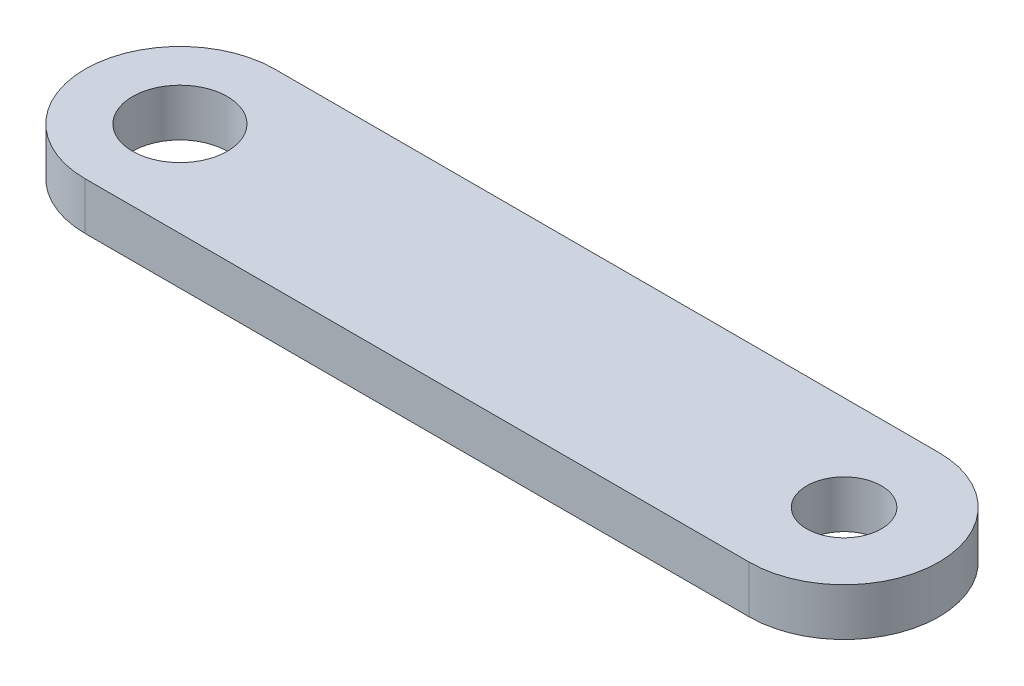
ISO-10303-21;
HEADER;
FILE_DESCRIPTION(('STEP AP214'),'2;1');
FILE_NAME('part.step','',(''),(''),'','','');
FILE_SCHEMA(('AUTOMOTIVE_DESIGN { 1 0 10303 214 1 1 1 1 }'));
ENDSEC;
DATA;
#1=APPLICATION_CONTEXT('core data for automotive mechanical design processes');
#2=APPLICATION_PROTOCOL_DEFINITION('international standard','automotive_design',2000,#1);
#3=PRODUCT_CONTEXT('',#1,'mechanical');
#4=PRODUCT('Part','Part','',(#3));
#5=PRODUCT_RELATED_PRODUCT_CATEGORY('part','',(#4));
#6=PRODUCT_DEFINITION_FORMATION('','',#4);
#7=PRODUCT_DEFINITION_CONTEXT('part definition',#1,'design');
#8=PRODUCT_DEFINITION('design','',#6,#7);
#9=PRODUCT_DEFINITION_SHAPE('','',#8);
#10=(LENGTH_UNIT() NAMED_UNIT(*) SI_UNIT(.MILLI.,.METRE.));
#11=(NAMED_UNIT(*) PLANE_ANGLE_UNIT() SI_UNIT($,.RADIAN.));
#12=(NAMED_UNIT(*) SI_UNIT($,.STERADIAN.) SOLID_ANGLE_UNIT());
#13=UNCERTAINTY_MEASURE_WITH_UNIT(LENGTH_MEASURE(1.E-05),#10,'distance_accuracy_value','');
#14=(GEOMETRIC_REPRESENTATION_CONTEXT(3) GLOBAL_UNCERTAINTY_ASSIGNED_CONTEXT((#13)) GLOBAL_UNIT_ASSIGNED_CONTEXT((#10,
#11,#12)) REPRESENTATION_CONTEXT('',''));
#15=CARTESIAN_POINT('',(0.,0.,0.));
#16=DIRECTION('',(0.,0.,1.));
#17=DIRECTION('',(1.,0.,0.));
#18=AXIS2_PLACEMENT_3D('',#15,#16,#17);
#19=CARTESIAN_POINT('',(0.,3.175,0.));
#20=DIRECTION('',(0.,1.,0.));
#21=DIRECTION('',(0.,0.,1.));
#22=AXIS2_PLACEMENT_3D('',#19,#20,#21);
#23=PLANE('',#22);
#24=CARTESIAN_POINT('',(0.,3.175,0.));
#25=DIRECTION('',(0.,1.,0.));
#26=DIRECTION('',(0.,0.,1.));
#27=AXIS2_PLACEMENT_3D('',#24,#25,#26);
#28=CIRCLE('',#27,3.175);
#29=CARTESIAN_POINT('',(0.,3.175,3.175));
#30=VERTEX_POINT('',#29);
#31=EDGE_CURVE('E112',#30,#30,#28,.T.);
#32=ORIENTED_EDGE('',*,*,#31,.F.);
#33=EDGE_LOOP('',(#32));
#34=FACE_BOUND('',#33,.T.);
#35=CARTESIAN_POINT('',(0.,3.175,0.));
#36=DIRECTION('',(0.,1.,0.));
#37=DIRECTION('',(0.,0.,1.));
#38=AXIS2_PLACEMENT_3D('',#35,#36,#37);
#39=CIRCLE('',#38,6.35);
#40=CARTESIAN_POINT('',(0.,3.175,-6.35));
#41=VERTEX_POINT('',#40);
#42=CARTESIAN_POINT('',(0.,3.175,6.35));
#43=VERTEX_POINT('',#42);
#44=EDGE_CURVE('E92',#41,#43,#39,.T.);
#45=ORIENTED_EDGE('',*,*,#44,.T.);
#46=DIRECTION('',(1.,0.,0.));
#47=VECTOR('',#46,1.);
#48=CARTESIAN_POINT('',(0.,3.175,6.35));
#49=LINE('',#48,#47);
#50=CARTESIAN_POINT('',(44.45,3.175,6.35));
#51=VERTEX_POINT('',#50);
#52=EDGE_CURVE('E87',#43,#51,#49,.T.);
#53=ORIENTED_EDGE('',*,*,#52,.T.);
#54=CARTESIAN_POINT('',(44.45,3.175,0.));
#55=DIRECTION('',(0.,1.,0.));
#56=DIRECTION('',(0.,0.,1.));
#57=AXIS2_PLACEMENT_3D('',#54,#55,#56);
#58=CIRCLE('',#57,6.35);
#59=CARTESIAN_POINT('',(44.45,3.175,-6.35));
#60=VERTEX_POINT('',#59);
#61=EDGE_CURVE('E90',#51,#60,#58,.T.);
#62=ORIENTED_EDGE('',*,*,#61,.T.);
#63=DIRECTION('',(-1.,0.,0.));
#64=VECTOR('',#63,1.);
#65=CARTESIAN_POINT('',(0.,3.175,-6.35));
#66=LINE('',#65,#64);
#67=EDGE_CURVE('E57',#60,#41,#66,.T.);
#68=ORIENTED_EDGE('',*,*,#67,.T.);
#69=EDGE_LOOP('',(#45,#53,#62,#68));
#70=FACE_BOUND('',#69,.T.);
#71=CARTESIAN_POINT('',(44.45,3.175,0.));
#72=DIRECTION('',(0.,1.,0.));
#73=DIRECTION('',(0.,0.,1.));
#74=AXIS2_PLACEMENT_3D('',#71,#72,#73);
#75=CIRCLE('',#74,2.5);
#76=CARTESIAN_POINT('',(44.45,3.175,2.5));
#77=VERTEX_POINT('',#76);
#78=EDGE_CURVE('E134',#77,#77,#75,.T.);
#79=ORIENTED_EDGE('',*,*,#78,.F.);
#80=EDGE_LOOP('',(#79));
#81=FACE_BOUND('',#80,.T.);
#82=ADVANCED_FACE('F39',(#34,#70,#81),#23,.T.);
#83=CARTESIAN_POINT('',(0.,0.,0.));
#84=DIRECTION('',(0.,1.,0.));
#85=DIRECTION('',(0.,0.,1.));
#86=AXIS2_PLACEMENT_3D('',#83,#84,#85);
#87=PLANE('',#86);
#88=CARTESIAN_POINT('',(0.,0.,0.));
#89=DIRECTION('',(0.,1.,0.));
#90=DIRECTION('',(0.,0.,1.));
#91=AXIS2_PLACEMENT_3D('',#88,#89,#90);
#92=CIRCLE('',#91,6.35);
#93=CARTESIAN_POINT('',(0.,0.,-6.35));
#94=VERTEX_POINT('',#93);
#95=CARTESIAN_POINT('',(0.,0.,6.35));
#96=VERTEX_POINT('',#95);
#97=EDGE_CURVE('E108',#94,#96,#92,.T.);
#98=ORIENTED_EDGE('',*,*,#97,.F.);
#99=DIRECTION('',(-1.,0.,0.));
#100=VECTOR('',#99,1.);
#101=CARTESIAN_POINT('',(0.,0.,-6.35));
#102=LINE('',#101,#100);
#103=CARTESIAN_POINT('',(44.45,0.,-6.35));
#104=VERTEX_POINT('',#103);
#105=EDGE_CURVE('E80',#104,#94,#102,.T.);
#106=ORIENTED_EDGE('',*,*,#105,.F.);
#107=CARTESIAN_POINT('',(44.45,0.,0.));
#108=DIRECTION('',(0.,1.,0.));
#109=DIRECTION('',(0.,0.,1.));
#110=AXIS2_PLACEMENT_3D('',#107,#108,#109);
#111=CIRCLE('',#110,6.35);
#112=CARTESIAN_POINT('',(44.45,0.,6.35));
#113=VERTEX_POINT('',#112);
#114=EDGE_CURVE('E74',#113,#104,#111,.T.);
#115=ORIENTED_EDGE('',*,*,#114,.F.);
#116=DIRECTION('',(1.,0.,0.));
#117=VECTOR('',#116,1.);
#118=CARTESIAN_POINT('',(0.,0.,6.35));
#119=LINE('',#118,#117);
#120=EDGE_CURVE('E97',#96,#113,#119,.T.);
#121=ORIENTED_EDGE('',*,*,#120,.F.);
#122=EDGE_LOOP('',(#98,#106,#115,#121));
#123=FACE_BOUND('',#122,.T.);
#124=CARTESIAN_POINT('',(0.,0.,0.));
#125=DIRECTION('',(0.,1.,0.));
#126=DIRECTION('',(0.,0.,1.));
#127=AXIS2_PLACEMENT_3D('',#124,#125,#126);
#128=CIRCLE('',#127,3.175);
#129=CARTESIAN_POINT('',(0.,0.,3.175));
#130=VERTEX_POINT('',#129);
#131=EDGE_CURVE('E130',#130,#130,#128,.T.);
#132=ORIENTED_EDGE('',*,*,#131,.T.);
#133=EDGE_LOOP('',(#132));
#134=FACE_BOUND('',#133,.T.);
#135=CARTESIAN_POINT('',(44.45,0.,0.));
#136=DIRECTION('',(0.,1.,0.));
#137=DIRECTION('',(0.,0.,1.));
#138=AXIS2_PLACEMENT_3D('',#135,#136,#137);
#139=CIRCLE('',#138,2.5);
#140=CARTESIAN_POINT('',(44.45,0.,2.5));
#141=VERTEX_POINT('',#140);
#142=EDGE_CURVE('E138',#141,#141,#139,.T.);
#143=ORIENTED_EDGE('',*,*,#142,.T.);
#144=EDGE_LOOP('',(#143));
#145=FACE_BOUND('',#144,.T.);
#146=ADVANCED_FACE('F125',(#123,#134,#145),#87,.F.);
#147=CARTESIAN_POINT('',(0.,3.175,0.));
#148=DIRECTION('',(0.,-1.,0.));
#149=DIRECTION('',(0.,0.,-1.));
#150=AXIS2_PLACEMENT_3D('',#147,#148,#149);
#151=CYLINDRICAL_SURFACE('',#150,6.35);
#152=ORIENTED_EDGE('',*,*,#97,.T.);
#153=DIRECTION('',(0.,-1.,0.));
#154=VECTOR('',#153,1.);
#155=CARTESIAN_POINT('',(0.,3.175,6.35));
#156=LINE('',#155,#154);
#157=EDGE_CURVE('E11',#43,#96,#156,.T.);
#158=ORIENTED_EDGE('',*,*,#157,.F.);
#159=ORIENTED_EDGE('',*,*,#44,.F.);
#160=DIRECTION('',(0.,-1.,0.));
#161=VECTOR('',#160,1.);
#162=CARTESIAN_POINT('',(0.,3.175,-6.35));
#163=LINE('',#162,#161);
#164=EDGE_CURVE('E104',#41,#94,#163,.T.);
#165=ORIENTED_EDGE('',*,*,#164,.T.);
#166=EDGE_LOOP('',(#152,#158,#159,#165));
#167=FACE_BOUND('',#166,.T.);
#168=ADVANCED_FACE('F41',(#167),#151,.T.);
#169=CARTESIAN_POINT('',(0.,3.175,6.35));
#170=DIRECTION('',(0.,0.,-1.));
#171=DIRECTION('',(-1.,0.,0.));
#172=AXIS2_PLACEMENT_3D('',#169,#170,#171);
#173=PLANE('',#172);
#174=ORIENTED_EDGE('',*,*,#120,.T.);
#175=DIRECTION('',(0.,-1.,0.));
#176=VECTOR('',#175,1.);
#177=CARTESIAN_POINT('',(44.45,3.175,6.35));
#178=LINE('',#177,#176);
#179=EDGE_CURVE('E49',#51,#113,#178,.T.);
#180=ORIENTED_EDGE('',*,*,#179,.F.);
#181=ORIENTED_EDGE('',*,*,#52,.F.);
#182=ORIENTED_EDGE('',*,*,#157,.T.);
#183=EDGE_LOOP('',(#174,#180,#181,#182));
#184=FACE_BOUND('',#183,.T.);
#185=ADVANCED_FACE('F96',(#184),#173,.F.);
#186=CARTESIAN_POINT('',(44.45,3.175,0.));
#187=DIRECTION('',(0.,-1.,0.));
#188=DIRECTION('',(0.,0.,-1.));
#189=AXIS2_PLACEMENT_3D('',#186,#187,#188);
#190=CYLINDRICAL_SURFACE('',#189,6.35);
#191=ORIENTED_EDGE('',*,*,#114,.T.);
#192=DIRECTION('',(0.,-1.,0.));
#193=VECTOR('',#192,1.);
#194=CARTESIAN_POINT('',(44.45,3.175,-6.35));
#195=LINE('',#194,#193);
#196=EDGE_CURVE('E99',#60,#104,#195,.T.);
#197=ORIENTED_EDGE('',*,*,#196,.F.);
#198=ORIENTED_EDGE('',*,*,#61,.F.);
#199=ORIENTED_EDGE('',*,*,#179,.T.);
#200=EDGE_LOOP('',(#191,#197,#198,#199));
#201=FACE_BOUND('',#200,.T.);
#202=ADVANCED_FACE('F100',(#201),#190,.T.);
#203=CARTESIAN_POINT('',(0.,3.175,-6.35));
#204=DIRECTION('',(0.,0.,1.));
#205=DIRECTION('',(1.,0.,0.));
#206=AXIS2_PLACEMENT_3D('',#203,#204,#205);
#207=PLANE('',#206);
#208=ORIENTED_EDGE('',*,*,#105,.T.);
#209=ORIENTED_EDGE('',*,*,#164,.F.);
#210=ORIENTED_EDGE('',*,*,#67,.F.);
#211=ORIENTED_EDGE('',*,*,#196,.T.);
#212=EDGE_LOOP('',(#208,#209,#210,#211));
#213=FACE_BOUND('',#212,.T.);
#214=ADVANCED_FACE('F122',(#213),#207,.F.);
#215=CARTESIAN_POINT('',(0.,3.175,0.));
#216=DIRECTION('',(0.,-1.,0.));
#217=DIRECTION('',(0.,0.,-1.));
#218=AXIS2_PLACEMENT_3D('',#215,#216,#217);
#219=CYLINDRICAL_SURFACE('',#218,3.175);
#220=ORIENTED_EDGE('',*,*,#31,.T.);
#221=EDGE_LOOP('',(#220));
#222=FACE_BOUND('',#221,.T.);
#223=ORIENTED_EDGE('',*,*,#131,.F.);
#224=EDGE_LOOP('',(#223));
#225=FACE_BOUND('',#224,.T.);
#226=ADVANCED_FACE('F157',(#222,#225),#219,.F.);
#227=CARTESIAN_POINT('',(44.45,3.175,0.));
#228=DIRECTION('',(0.,-1.,0.));
#229=DIRECTION('',(0.,0.,-1.));
#230=AXIS2_PLACEMENT_3D('',#227,#228,#229);
#231=CYLINDRICAL_SURFACE('',#230,2.5);
#232=ORIENTED_EDGE('',*,*,#78,.T.);
#233=EDGE_LOOP('',(#232));
#234=FACE_BOUND('',#233,.T.);
#235=ORIENTED_EDGE('',*,*,#142,.F.);
#236=EDGE_LOOP('',(#235));
#237=FACE_BOUND('',#236,.T.);
#238=ADVANCED_FACE('F146',(#234,#237),#231,.F.);
#239=CLOSED_SHELL('',(#82,#146,#168,#185,#202,#214,#226,#238));
#240=MANIFOLD_SOLID_BREP('B2',#239);
#241=ADVANCED_BREP_SHAPE_REPRESENTATION('',(#18,#240),#14);
#242=SHAPE_DEFINITION_REPRESENTATION(#9,#241);
ENDSEC;
END-ISO-10303-21;
